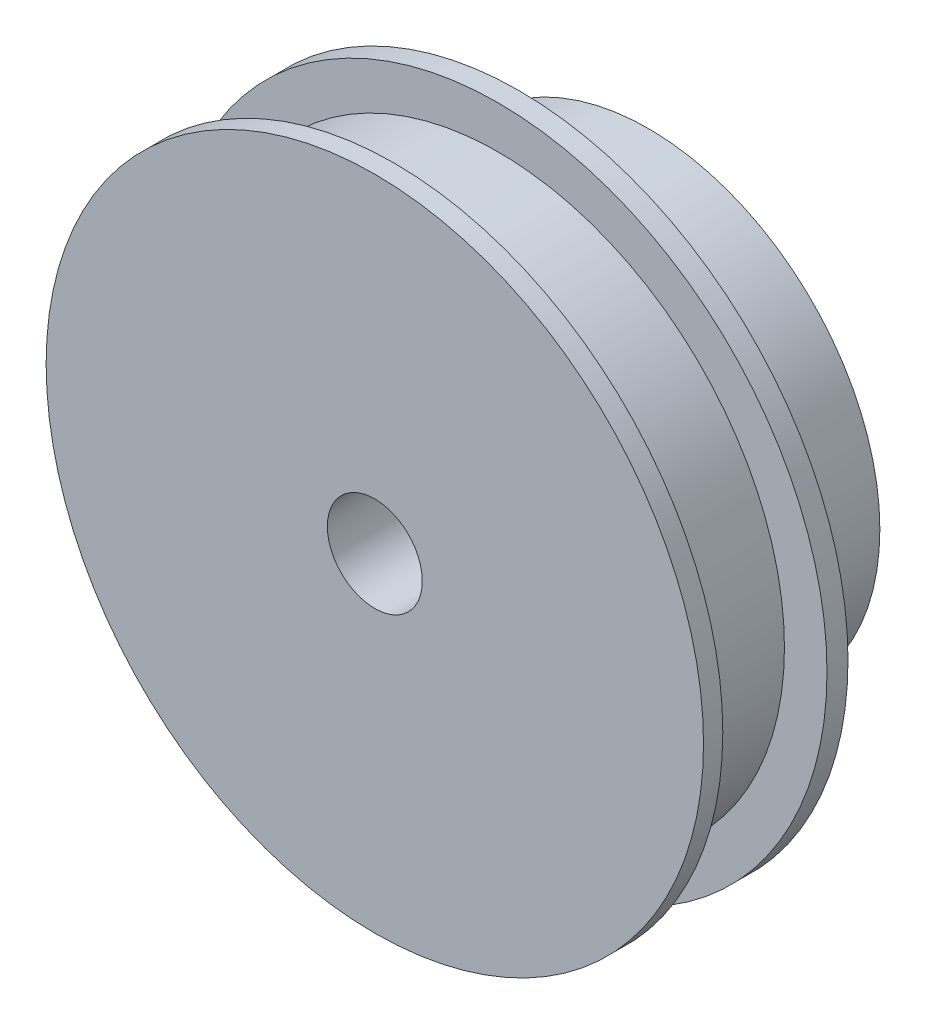
ISO-10303-21;
HEADER;
FILE_DESCRIPTION(('STEP AP214'),'2;1');
FILE_NAME('part.step','',(''),(''),'','','');
FILE_SCHEMA(('AUTOMOTIVE_DESIGN { 1 0 10303 214 1 1 1 1 }'));
ENDSEC;
DATA;
#1=APPLICATION_CONTEXT('core data for automotive mechanical design processes');
#2=APPLICATION_PROTOCOL_DEFINITION('international standard','automotive_design',2000,#1);
#3=PRODUCT_CONTEXT('',#1,'mechanical');
#4=PRODUCT('Part','Part','',(#3));
#5=PRODUCT_RELATED_PRODUCT_CATEGORY('part','',(#4));
#6=PRODUCT_DEFINITION_FORMATION('','',#4);
#7=PRODUCT_DEFINITION_CONTEXT('part definition',#1,'design');
#8=PRODUCT_DEFINITION('design','',#6,#7);
#9=PRODUCT_DEFINITION_SHAPE('','',#8);
#10=(LENGTH_UNIT() NAMED_UNIT(*) SI_UNIT(.MILLI.,.METRE.));
#11=(NAMED_UNIT(*) PLANE_ANGLE_UNIT() SI_UNIT($,.RADIAN.));
#12=(NAMED_UNIT(*) SI_UNIT($,.STERADIAN.) SOLID_ANGLE_UNIT());
#13=UNCERTAINTY_MEASURE_WITH_UNIT(LENGTH_MEASURE(1.E-05),#10,'distance_accuracy_value','');
#14=(GEOMETRIC_REPRESENTATION_CONTEXT(3) GLOBAL_UNCERTAINTY_ASSIGNED_CONTEXT((#13)) GLOBAL_UNIT_ASSIGNED_CONTEXT((#10,
#11,#12)) REPRESENTATION_CONTEXT('',''));
#15=CARTESIAN_POINT('',(0.,0.,0.));
#16=DIRECTION('',(0.,0.,1.));
#17=DIRECTION('',(1.,0.,0.));
#18=AXIS2_PLACEMENT_3D('',#15,#16,#17);
#19=CARTESIAN_POINT('',(0.,0.,1.4097));
#20=DIRECTION('',(0.,0.,1.));
#21=DIRECTION('',(1.,0.,0.));
#22=AXIS2_PLACEMENT_3D('',#19,#20,#21);
#23=PLANE('',#22);
#24=CARTESIAN_POINT('',(0.,0.,1.4097));
#25=DIRECTION('',(0.,0.,1.));
#26=DIRECTION('',(1.,0.,0.));
#27=AXIS2_PLACEMENT_3D('',#24,#25,#26);
#28=CIRCLE('',#27,22.0726);
#29=CARTESIAN_POINT('',(22.0726,0.,1.4097));
#30=VERTEX_POINT('',#29);
#31=EDGE_CURVE('E42',#30,#30,#28,.T.);
#32=ORIENTED_EDGE('',*,*,#31,.T.);
#33=EDGE_LOOP('',(#32));
#34=FACE_BOUND('',#33,.T.);
#35=CARTESIAN_POINT('',(0.,0.,1.4097));
#36=DIRECTION('',(0.,0.,1.));
#37=DIRECTION('',(1.,0.,0.));
#38=AXIS2_PLACEMENT_3D('',#35,#36,#37);
#39=CIRCLE('',#38,19.2151);
#40=CARTESIAN_POINT('',(19.2151,0.,1.4097));
#41=VERTEX_POINT('',#40);
#42=EDGE_CURVE('E50',#41,#41,#39,.T.);
#43=ORIENTED_EDGE('',*,*,#42,.F.);
#44=EDGE_LOOP('',(#43));
#45=FACE_BOUND('',#44,.T.);
#46=ADVANCED_FACE('F31',(#34,#45),#23,.T.);
#47=CARTESIAN_POINT('',(0.,0.,-8.6741));
#48=DIRECTION('',(0.,0.,1.));
#49=DIRECTION('',(1.,0.,0.));
#50=AXIS2_PLACEMENT_3D('',#47,#48,#49);
#51=CYLINDRICAL_SURFACE('',#50,15.53845);
#52=CARTESIAN_POINT('',(0.,0.,-8.6741));
#53=DIRECTION('',(0.,0.,1.));
#54=DIRECTION('',(1.,0.,0.));
#55=AXIS2_PLACEMENT_3D('',#52,#53,#54);
#56=CIRCLE('',#55,15.53845);
#57=CARTESIAN_POINT('',(15.53845,0.,-8.6741));
#58=VERTEX_POINT('',#57);
#59=EDGE_CURVE('E10',#58,#58,#56,.T.);
#60=ORIENTED_EDGE('',*,*,#59,.T.);
#61=EDGE_LOOP('',(#60));
#62=FACE_BOUND('',#61,.T.);
#63=CARTESIAN_POINT('',(0.,0.,0.));
#64=DIRECTION('',(0.,0.,1.));
#65=DIRECTION('',(1.,0.,0.));
#66=AXIS2_PLACEMENT_3D('',#63,#64,#65);
#67=CIRCLE('',#66,15.53845);
#68=CARTESIAN_POINT('',(15.53845,0.,0.));
#69=VERTEX_POINT('',#68);
#70=EDGE_CURVE('E35',#69,#69,#67,.T.);
#71=ORIENTED_EDGE('',*,*,#70,.F.);
#72=EDGE_LOOP('',(#71));
#73=FACE_BOUND('',#72,.T.);
#74=ADVANCED_FACE('F33',(#62,#73),#51,.T.);
#75=CARTESIAN_POINT('',(0.,0.,-8.6741));
#76=DIRECTION('',(0.,0.,1.));
#77=DIRECTION('',(1.,0.,0.));
#78=AXIS2_PLACEMENT_3D('',#75,#76,#77);
#79=PLANE('',#78);
#80=CARTESIAN_POINT('',(0.,0.,-8.6741));
#81=DIRECTION('',(0.,0.,-1.));
#82=DIRECTION('',(-1.,0.,0.));
#83=AXIS2_PLACEMENT_3D('',#80,#81,#82);
#84=CIRCLE('',#83,3.1877);
#85=CARTESIAN_POINT('',(-3.1877,0.,-8.6741));
#86=VERTEX_POINT('',#85);
#87=EDGE_CURVE('E62',#86,#86,#84,.T.);
#88=ORIENTED_EDGE('',*,*,#87,.F.);
#89=EDGE_LOOP('',(#88));
#90=FACE_BOUND('',#89,.T.);
#91=ORIENTED_EDGE('',*,*,#59,.F.);
#92=EDGE_LOOP('',(#91));
#93=FACE_BOUND('',#92,.T.);
#94=ADVANCED_FACE('F77',(#90,#93),#79,.F.);
#95=CARTESIAN_POINT('',(0.,0.,1.4097));
#96=DIRECTION('',(0.,0.,-1.));
#97=DIRECTION('',(-1.,0.,0.));
#98=AXIS2_PLACEMENT_3D('',#95,#96,#97);
#99=CYLINDRICAL_SURFACE('',#98,22.0726);
#100=ORIENTED_EDGE('',*,*,#31,.F.);
#101=EDGE_LOOP('',(#100));
#102=FACE_BOUND('',#101,.T.);
#103=CARTESIAN_POINT('',(0.,0.,0.));
#104=DIRECTION('',(0.,0.,1.));
#105=DIRECTION('',(1.,0.,0.));
#106=AXIS2_PLACEMENT_3D('',#103,#104,#105);
#107=CIRCLE('',#106,22.0726);
#108=CARTESIAN_POINT('',(22.0726,0.,0.));
#109=VERTEX_POINT('',#108);
#110=EDGE_CURVE('E44',#109,#109,#107,.T.);
#111=ORIENTED_EDGE('',*,*,#110,.T.);
#112=EDGE_LOOP('',(#111));
#113=FACE_BOUND('',#112,.T.);
#114=ADVANCED_FACE('F80',(#102,#113),#99,.T.);
#115=CARTESIAN_POINT('',(0.,0.,0.));
#116=DIRECTION('',(0.,0.,1.));
#117=DIRECTION('',(1.,0.,0.));
#118=AXIS2_PLACEMENT_3D('',#115,#116,#117);
#119=PLANE('',#118);
#120=ORIENTED_EDGE('',*,*,#70,.T.);
#121=EDGE_LOOP('',(#120));
#122=FACE_BOUND('',#121,.T.);
#123=ORIENTED_EDGE('',*,*,#110,.F.);
#124=EDGE_LOOP('',(#123));
#125=FACE_BOUND('',#124,.T.);
#126=ADVANCED_FACE('F85',(#122,#125),#119,.F.);
#127=CARTESIAN_POINT('',(0.,0.,8.4074));
#128=DIRECTION('',(0.,0.,-1.));
#129=DIRECTION('',(-1.,0.,0.));
#130=AXIS2_PLACEMENT_3D('',#127,#128,#129);
#131=CYLINDRICAL_SURFACE('',#130,19.2151);
#132=CARTESIAN_POINT('',(0.,0.,8.4074));
#133=DIRECTION('',(0.,0.,1.));
#134=DIRECTION('',(1.,0.,0.));
#135=AXIS2_PLACEMENT_3D('',#132,#133,#134);
#136=CIRCLE('',#135,19.2151);
#137=CARTESIAN_POINT('',(19.2151,0.,8.4074));
#138=VERTEX_POINT('',#137);
#139=EDGE_CURVE('E47',#138,#138,#136,.T.);
#140=ORIENTED_EDGE('',*,*,#139,.F.);
#141=EDGE_LOOP('',(#140));
#142=FACE_BOUND('',#141,.T.);
#143=ORIENTED_EDGE('',*,*,#42,.T.);
#144=EDGE_LOOP('',(#143));
#145=FACE_BOUND('',#144,.T.);
#146=ADVANCED_FACE('F96',(#142,#145),#131,.T.);
#147=CARTESIAN_POINT('',(0.,0.,8.4074));
#148=DIRECTION('',(0.,0.,1.));
#149=DIRECTION('',(1.,0.,0.));
#150=AXIS2_PLACEMENT_3D('',#147,#148,#149);
#151=PLANE('',#150);
#152=CARTESIAN_POINT('',(0.,0.,8.4074));
#153=DIRECTION('',(0.,0.,1.));
#154=DIRECTION('',(1.,0.,0.));
#155=AXIS2_PLACEMENT_3D('',#152,#153,#154);
#156=CIRCLE('',#155,22.0726);
#157=CARTESIAN_POINT('',(22.0726,0.,8.4074));
#158=VERTEX_POINT('',#157);
#159=EDGE_CURVE('E56',#158,#158,#156,.T.);
#160=ORIENTED_EDGE('',*,*,#159,.F.);
#161=EDGE_LOOP('',(#160));
#162=FACE_BOUND('',#161,.T.);
#163=ORIENTED_EDGE('',*,*,#139,.T.);
#164=EDGE_LOOP('',(#163));
#165=FACE_BOUND('',#164,.T.);
#166=ADVANCED_FACE('F103',(#162,#165),#151,.F.);
#167=CARTESIAN_POINT('',(0.,0.,9.7028));
#168=DIRECTION('',(0.,0.,-1.));
#169=DIRECTION('',(-1.,0.,0.));
#170=AXIS2_PLACEMENT_3D('',#167,#168,#169);
#171=CYLINDRICAL_SURFACE('',#170,22.0726);
#172=CARTESIAN_POINT('',(0.,0.,9.7028));
#173=DIRECTION('',(0.,0.,1.));
#174=DIRECTION('',(1.,0.,0.));
#175=AXIS2_PLACEMENT_3D('',#172,#173,#174);
#176=CIRCLE('',#175,22.0726);
#177=CARTESIAN_POINT('',(22.0726,0.,9.7028));
#178=VERTEX_POINT('',#177);
#179=EDGE_CURVE('E53',#178,#178,#176,.T.);
#180=ORIENTED_EDGE('',*,*,#179,.F.);
#181=EDGE_LOOP('',(#180));
#182=FACE_BOUND('',#181,.T.);
#183=ORIENTED_EDGE('',*,*,#159,.T.);
#184=EDGE_LOOP('',(#183));
#185=FACE_BOUND('',#184,.T.);
#186=ADVANCED_FACE('F113',(#182,#185),#171,.T.);
#187=CARTESIAN_POINT('',(0.,0.,9.7028));
#188=DIRECTION('',(0.,0.,1.));
#189=DIRECTION('',(1.,0.,0.));
#190=AXIS2_PLACEMENT_3D('',#187,#188,#189);
#191=PLANE('',#190);
#192=CARTESIAN_POINT('',(0.,0.,9.7028));
#193=DIRECTION('',(0.,0.,-1.));
#194=DIRECTION('',(-1.,0.,0.));
#195=AXIS2_PLACEMENT_3D('',#192,#193,#194);
#196=CIRCLE('',#195,3.1877);
#197=CARTESIAN_POINT('',(-3.1877,0.,9.7028));
#198=VERTEX_POINT('',#197);
#199=EDGE_CURVE('E59',#198,#198,#196,.T.);
#200=ORIENTED_EDGE('',*,*,#199,.T.);
#201=EDGE_LOOP('',(#200));
#202=FACE_BOUND('',#201,.T.);
#203=ORIENTED_EDGE('',*,*,#179,.T.);
#204=EDGE_LOOP('',(#203));
#205=FACE_BOUND('',#204,.T.);
#206=ADVANCED_FACE('F68',(#202,#205),#191,.T.);
#207=CARTESIAN_POINT('',(0.,0.,9.7028));
#208=DIRECTION('',(0.,0.,-1.));
#209=DIRECTION('',(-1.,0.,0.));
#210=AXIS2_PLACEMENT_3D('',#207,#208,#209);
#211=CYLINDRICAL_SURFACE('',#210,3.1877);
#212=ORIENTED_EDGE('',*,*,#199,.F.);
#213=EDGE_LOOP('',(#212));
#214=FACE_BOUND('',#213,.T.);
#215=ORIENTED_EDGE('',*,*,#87,.T.);
#216=EDGE_LOOP('',(#215));
#217=FACE_BOUND('',#216,.T.);
#218=ADVANCED_FACE('F71',(#214,#217),#211,.F.);
#219=CLOSED_SHELL('',(#46,#74,#94,#114,#126,#146,#166,#186,#206,#218));
#220=MANIFOLD_SOLID_BREP('B2',#219);
#221=ADVANCED_BREP_SHAPE_REPRESENTATION('',(#18,#220),#14);
#222=SHAPE_DEFINITION_REPRESENTATION(#9,#221);
ENDSEC;
END-ISO-10303-21;
